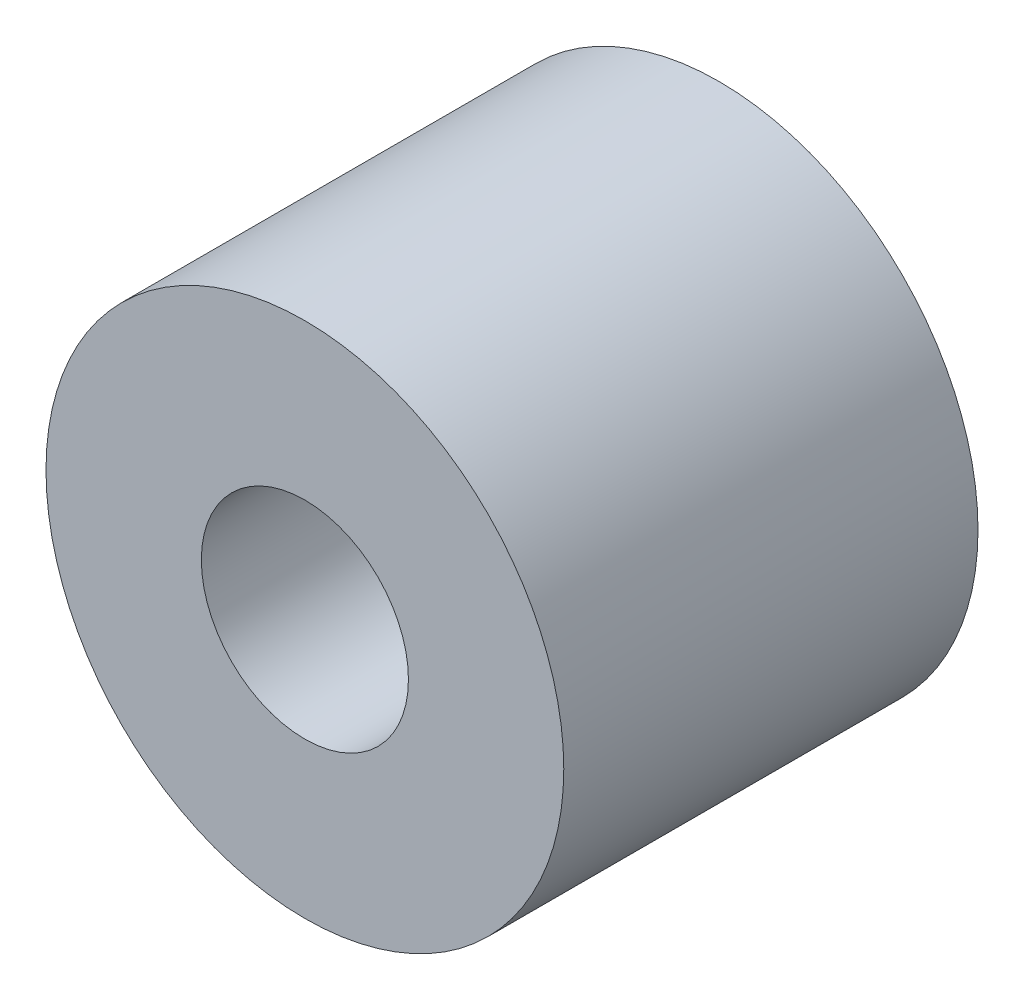
ISO-10303-21;
HEADER;
FILE_DESCRIPTION(('STEP AP214'),'2;1');
FILE_NAME('part.step','',(''),(''),'','','');
FILE_SCHEMA(('AUTOMOTIVE_DESIGN { 1 0 10303 214 1 1 1 1 }'));
ENDSEC;
DATA;
#1=APPLICATION_CONTEXT('core data for automotive mechanical design processes');
#2=APPLICATION_PROTOCOL_DEFINITION('international standard','automotive_design',2000,#1);
#3=PRODUCT_CONTEXT('',#1,'mechanical');
#4=PRODUCT('Part','Part','',(#3));
#5=PRODUCT_RELATED_PRODUCT_CATEGORY('part','',(#4));
#6=PRODUCT_DEFINITION_FORMATION('','',#4);
#7=PRODUCT_DEFINITION_CONTEXT('part definition',#1,'design');
#8=PRODUCT_DEFINITION('design','',#6,#7);
#9=PRODUCT_DEFINITION_SHAPE('','',#8);
#10=(LENGTH_UNIT() NAMED_UNIT(*) SI_UNIT(.MILLI.,.METRE.));
#11=(NAMED_UNIT(*) PLANE_ANGLE_UNIT() SI_UNIT($,.RADIAN.));
#12=(NAMED_UNIT(*) SI_UNIT($,.STERADIAN.) SOLID_ANGLE_UNIT());
#13=UNCERTAINTY_MEASURE_WITH_UNIT(LENGTH_MEASURE(1.E-05),#10,'distance_accuracy_value','');
#14=(GEOMETRIC_REPRESENTATION_CONTEXT(3) GLOBAL_UNCERTAINTY_ASSIGNED_CONTEXT((#13)) GLOBAL_UNIT_ASSIGNED_CONTEXT((#10,
#11,#12)) REPRESENTATION_CONTEXT('',''));
#15=CARTESIAN_POINT('',(0.,0.,0.));
#16=DIRECTION('',(0.,0.,1.));
#17=DIRECTION('',(1.,0.,0.));
#18=AXIS2_PLACEMENT_3D('',#15,#16,#17);
#19=CARTESIAN_POINT('',(0.,0.,4.));
#20=DIRECTION('',(0.,0.,1.));
#21=DIRECTION('',(1.,0.,0.));
#22=AXIS2_PLACEMENT_3D('',#19,#20,#21);
#23=PLANE('',#22);
#24=CARTESIAN_POINT('',(0.,0.,4.));
#25=DIRECTION('',(0.,0.,1.));
#26=DIRECTION('',(1.,0.,0.));
#27=AXIS2_PLACEMENT_3D('',#24,#25,#26);
#28=CIRCLE('',#27,2.5);
#29=CARTESIAN_POINT('',(2.5,0.,4.));
#30=VERTEX_POINT('',#29);
#31=EDGE_CURVE('E11',#30,#30,#28,.T.);
#32=ORIENTED_EDGE('',*,*,#31,.T.);
#33=EDGE_LOOP('',(#32));
#34=FACE_BOUND('',#33,.T.);
#35=CARTESIAN_POINT('',(0.,0.,4.));
#36=DIRECTION('',(0.,0.,1.));
#37=DIRECTION('',(1.,0.,0.));
#38=AXIS2_PLACEMENT_3D('',#35,#36,#37);
#39=CIRCLE('',#38,1.);
#40=CARTESIAN_POINT('',(1.,0.,4.));
#41=VERTEX_POINT('',#40);
#42=EDGE_CURVE('E54',#41,#41,#39,.T.);
#43=ORIENTED_EDGE('',*,*,#42,.F.);
#44=EDGE_LOOP('',(#43));
#45=FACE_BOUND('',#44,.T.);
#46=ADVANCED_FACE('F43',(#34,#45),#23,.T.);
#47=CARTESIAN_POINT('',(0.,0.,0.));
#48=DIRECTION('',(0.,0.,1.));
#49=DIRECTION('',(1.,0.,0.));
#50=AXIS2_PLACEMENT_3D('',#47,#48,#49);
#51=PLANE('',#50);
#52=CARTESIAN_POINT('',(0.,0.,0.));
#53=DIRECTION('',(0.,0.,1.));
#54=DIRECTION('',(1.,0.,0.));
#55=AXIS2_PLACEMENT_3D('',#52,#53,#54);
#56=CIRCLE('',#55,2.5);
#57=CARTESIAN_POINT('',(2.5,0.,0.));
#58=VERTEX_POINT('',#57);
#59=EDGE_CURVE('E47',#58,#58,#56,.T.);
#60=ORIENTED_EDGE('',*,*,#59,.F.);
#61=EDGE_LOOP('',(#60));
#62=FACE_BOUND('',#61,.T.);
#63=CARTESIAN_POINT('',(0.,0.,0.));
#64=DIRECTION('',(0.,0.,1.));
#65=DIRECTION('',(1.,0.,0.));
#66=AXIS2_PLACEMENT_3D('',#63,#64,#65);
#67=CIRCLE('',#66,1.);
#68=CARTESIAN_POINT('',(1.,0.,0.));
#69=VERTEX_POINT('',#68);
#70=EDGE_CURVE('E56',#69,#69,#67,.T.);
#71=ORIENTED_EDGE('',*,*,#70,.T.);
#72=EDGE_LOOP('',(#71));
#73=FACE_BOUND('',#72,.T.);
#74=ADVANCED_FACE('F66',(#62,#73),#51,.F.);
#75=CARTESIAN_POINT('',(0.,0.,4.));
#76=DIRECTION('',(0.,0.,-1.));
#77=DIRECTION('',(-1.,0.,0.));
#78=AXIS2_PLACEMENT_3D('',#75,#76,#77);
#79=CYLINDRICAL_SURFACE('',#78,2.5);
#80=ORIENTED_EDGE('',*,*,#31,.F.);
#81=EDGE_LOOP('',(#80));
#82=FACE_BOUND('',#81,.T.);
#83=ORIENTED_EDGE('',*,*,#59,.T.);
#84=EDGE_LOOP('',(#83));
#85=FACE_BOUND('',#84,.T.);
#86=ADVANCED_FACE('F45',(#82,#85),#79,.T.);
#87=CARTESIAN_POINT('',(0.,0.,4.));
#88=DIRECTION('',(0.,0.,-1.));
#89=DIRECTION('',(-1.,0.,0.));
#90=AXIS2_PLACEMENT_3D('',#87,#88,#89);
#91=CYLINDRICAL_SURFACE('',#90,1.);
#92=ORIENTED_EDGE('',*,*,#42,.T.);
#93=EDGE_LOOP('',(#92));
#94=FACE_BOUND('',#93,.T.);
#95=ORIENTED_EDGE('',*,*,#70,.F.);
#96=EDGE_LOOP('',(#95));
#97=FACE_BOUND('',#96,.T.);
#98=ADVANCED_FACE('F62',(#94,#97),#91,.F.);
#99=CLOSED_SHELL('',(#46,#74,#86,#98));
#100=MANIFOLD_SOLID_BREP('B2',#99);
#101=ADVANCED_BREP_SHAPE_REPRESENTATION('',(#18,#100),#14);
#102=SHAPE_DEFINITION_REPRESENTATION(#9,#101);
ENDSEC;
END-ISO-10303-21;
